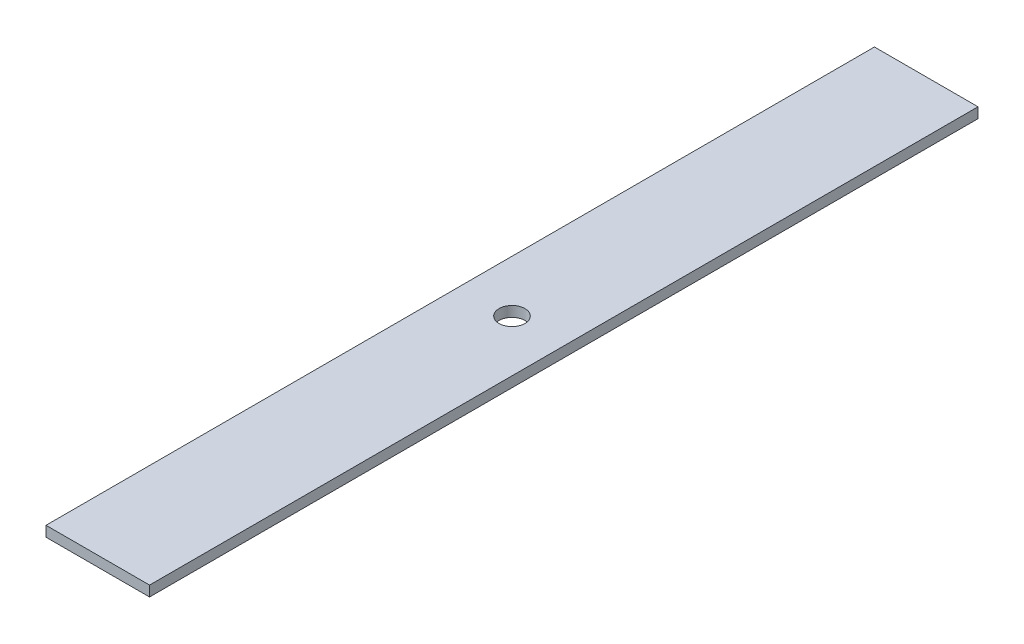
ISO-10303-21;
HEADER;
FILE_DESCRIPTION(('STEP AP214'),'2;1');
FILE_NAME('part.step','',(''),(''),'','','');
FILE_SCHEMA(('AUTOMOTIVE_DESIGN { 1 0 10303 214 1 1 1 1 }'));
ENDSEC;
DATA;
#1=APPLICATION_CONTEXT('core data for automotive mechanical design processes');
#2=APPLICATION_PROTOCOL_DEFINITION('international standard','automotive_design',2000,#1);
#3=PRODUCT_CONTEXT('',#1,'mechanical');
#4=PRODUCT('Part','Part','',(#3));
#5=PRODUCT_RELATED_PRODUCT_CATEGORY('part','',(#4));
#6=PRODUCT_DEFINITION_FORMATION('','',#4);
#7=PRODUCT_DEFINITION_CONTEXT('part definition',#1,'design');
#8=PRODUCT_DEFINITION('design','',#6,#7);
#9=PRODUCT_DEFINITION_SHAPE('','',#8);
#10=(LENGTH_UNIT() NAMED_UNIT(*) SI_UNIT(.MILLI.,.METRE.));
#11=(NAMED_UNIT(*) PLANE_ANGLE_UNIT() SI_UNIT($,.RADIAN.));
#12=(NAMED_UNIT(*) SI_UNIT($,.STERADIAN.) SOLID_ANGLE_UNIT());
#13=UNCERTAINTY_MEASURE_WITH_UNIT(LENGTH_MEASURE(1.E-05),#10,'distance_accuracy_value','');
#14=(GEOMETRIC_REPRESENTATION_CONTEXT(3) GLOBAL_UNCERTAINTY_ASSIGNED_CONTEXT((#13)) GLOBAL_UNIT_ASSIGNED_CONTEXT((#10,
#11,#12)) REPRESENTATION_CONTEXT('',''));
#15=CARTESIAN_POINT('',(0.,0.,0.));
#16=DIRECTION('',(0.,0.,1.));
#17=DIRECTION('',(1.,0.,0.));
#18=AXIS2_PLACEMENT_3D('',#15,#16,#17);
#19=CARTESIAN_POINT('',(0.,2.54,0.));
#20=DIRECTION('',(0.,-1.,0.));
#21=DIRECTION('',(0.,0.,-1.));
#22=AXIS2_PLACEMENT_3D('',#19,#20,#21);
#23=PLANE('',#22);
#24=DIRECTION('',(0.,0.,1.));
#25=VECTOR('',#24,1.);
#26=CARTESIAN_POINT('',(0.,2.54,0.));
#27=LINE('',#26,#25);
#28=CARTESIAN_POINT('',(0.,2.54,-203.2));
#29=VERTEX_POINT('',#28);
#30=CARTESIAN_POINT('',(0.,2.54,0.));
#31=VERTEX_POINT('',#30);
#32=EDGE_CURVE('E91',#29,#31,#27,.T.);
#33=ORIENTED_EDGE('',*,*,#32,.T.);
#34=DIRECTION('',(1.,0.,0.));
#35=VECTOR('',#34,1.);
#36=CARTESIAN_POINT('',(0.,2.54,0.));
#37=LINE('',#36,#35);
#38=CARTESIAN_POINT('',(25.4,2.54,0.));
#39=VERTEX_POINT('',#38);
#40=EDGE_CURVE('E86',#31,#39,#37,.T.);
#41=ORIENTED_EDGE('',*,*,#40,.T.);
#42=DIRECTION('',(0.,0.,-1.));
#43=VECTOR('',#42,1.);
#44=CARTESIAN_POINT('',(25.4,2.54,0.));
#45=LINE('',#44,#43);
#46=CARTESIAN_POINT('',(25.4,2.54,-203.2));
#47=VERTEX_POINT('',#46);
#48=EDGE_CURVE('E89',#39,#47,#45,.T.);
#49=ORIENTED_EDGE('',*,*,#48,.T.);
#50=DIRECTION('',(-1.,0.,0.));
#51=VECTOR('',#50,1.);
#52=CARTESIAN_POINT('',(0.,2.54,-203.2));
#53=LINE('',#52,#51);
#54=EDGE_CURVE('E56',#47,#29,#53,.T.);
#55=ORIENTED_EDGE('',*,*,#54,.T.);
#56=EDGE_LOOP('',(#33,#41,#49,#55));
#57=FACE_BOUND('',#56,.T.);
#58=CARTESIAN_POINT('',(12.7,2.54,-101.6));
#59=DIRECTION('',(0.,1.,0.));
#60=DIRECTION('',(0.,0.,1.));
#61=AXIS2_PLACEMENT_3D('',#58,#59,#60);
#62=CIRCLE('',#61,3.175);
#63=CARTESIAN_POINT('',(12.7,2.54,-98.425));
#64=VERTEX_POINT('',#63);
#65=EDGE_CURVE('E106',#64,#64,#62,.T.);
#66=ORIENTED_EDGE('',*,*,#65,.F.);
#67=EDGE_LOOP('',(#66));
#68=FACE_BOUND('',#67,.T.);
#69=ADVANCED_FACE('F39',(#57,#68),#23,.F.);
#70=CARTESIAN_POINT('',(0.,0.,0.));
#71=DIRECTION('',(0.,-1.,0.));
#72=DIRECTION('',(0.,0.,-1.));
#73=AXIS2_PLACEMENT_3D('',#70,#71,#72);
#74=PLANE('',#73);
#75=DIRECTION('',(0.,0.,1.));
#76=VECTOR('',#75,1.);
#77=CARTESIAN_POINT('',(0.,0.,0.));
#78=LINE('',#77,#76);
#79=CARTESIAN_POINT('',(0.,0.,-203.2));
#80=VERTEX_POINT('',#79);
#81=CARTESIAN_POINT('',(0.,0.,0.));
#82=VERTEX_POINT('',#81);
#83=EDGE_CURVE('E103',#80,#82,#78,.T.);
#84=ORIENTED_EDGE('',*,*,#83,.F.);
#85=DIRECTION('',(-1.,0.,0.));
#86=VECTOR('',#85,1.);
#87=CARTESIAN_POINT('',(0.,0.,-203.2));
#88=LINE('',#87,#86);
#89=CARTESIAN_POINT('',(25.4,0.,-203.2));
#90=VERTEX_POINT('',#89);
#91=EDGE_CURVE('E79',#90,#80,#88,.T.);
#92=ORIENTED_EDGE('',*,*,#91,.F.);
#93=DIRECTION('',(0.,0.,-1.));
#94=VECTOR('',#93,1.);
#95=CARTESIAN_POINT('',(25.4,0.,0.));
#96=LINE('',#95,#94);
#97=CARTESIAN_POINT('',(25.4,0.,0.));
#98=VERTEX_POINT('',#97);
#99=EDGE_CURVE('E73',#98,#90,#96,.T.);
#100=ORIENTED_EDGE('',*,*,#99,.F.);
#101=DIRECTION('',(1.,0.,0.));
#102=VECTOR('',#101,1.);
#103=CARTESIAN_POINT('',(0.,0.,0.));
#104=LINE('',#103,#102);
#105=EDGE_CURVE('E95',#82,#98,#104,.T.);
#106=ORIENTED_EDGE('',*,*,#105,.F.);
#107=EDGE_LOOP('',(#84,#92,#100,#106));
#108=FACE_BOUND('',#107,.T.);
#109=CARTESIAN_POINT('',(12.7,0.,-101.6));
#110=DIRECTION('',(0.,1.,0.));
#111=DIRECTION('',(0.,0.,1.));
#112=AXIS2_PLACEMENT_3D('',#109,#110,#111);
#113=CIRCLE('',#112,3.175);
#114=CARTESIAN_POINT('',(12.7,0.,-98.425));
#115=VERTEX_POINT('',#114);
#116=EDGE_CURVE('E118',#115,#115,#113,.T.);
#117=ORIENTED_EDGE('',*,*,#116,.T.);
#118=EDGE_LOOP('',(#117));
#119=FACE_BOUND('',#118,.T.);
#120=ADVANCED_FACE('F114',(#108,#119),#74,.T.);
#121=CARTESIAN_POINT('',(0.,2.54,0.));
#122=DIRECTION('',(1.,0.,0.));
#123=DIRECTION('',(0.,0.,-1.));
#124=AXIS2_PLACEMENT_3D('',#121,#122,#123);
#125=PLANE('',#124);
#126=ORIENTED_EDGE('',*,*,#83,.T.);
#127=DIRECTION('',(0.,-1.,0.));
#128=VECTOR('',#127,1.);
#129=CARTESIAN_POINT('',(0.,2.54,0.));
#130=LINE('',#129,#128);
#131=EDGE_CURVE('E11',#31,#82,#130,.T.);
#132=ORIENTED_EDGE('',*,*,#131,.F.);
#133=ORIENTED_EDGE('',*,*,#32,.F.);
#134=DIRECTION('',(0.,-1.,0.));
#135=VECTOR('',#134,1.);
#136=CARTESIAN_POINT('',(0.,2.54,-203.2));
#137=LINE('',#136,#135);
#138=EDGE_CURVE('E99',#29,#80,#137,.T.);
#139=ORIENTED_EDGE('',*,*,#138,.T.);
#140=EDGE_LOOP('',(#126,#132,#133,#139));
#141=FACE_BOUND('',#140,.T.);
#142=ADVANCED_FACE('F41',(#141),#125,.F.);
#143=CARTESIAN_POINT('',(0.,2.54,0.));
#144=DIRECTION('',(0.,0.,-1.));
#145=DIRECTION('',(-1.,0.,0.));
#146=AXIS2_PLACEMENT_3D('',#143,#144,#145);
#147=PLANE('',#146);
#148=ORIENTED_EDGE('',*,*,#105,.T.);
#149=DIRECTION('',(0.,-1.,0.));
#150=VECTOR('',#149,1.);
#151=CARTESIAN_POINT('',(25.4,2.54,0.));
#152=LINE('',#151,#150);
#153=EDGE_CURVE('E48',#39,#98,#152,.T.);
#154=ORIENTED_EDGE('',*,*,#153,.F.);
#155=ORIENTED_EDGE('',*,*,#40,.F.);
#156=ORIENTED_EDGE('',*,*,#131,.T.);
#157=EDGE_LOOP('',(#148,#154,#155,#156));
#158=FACE_BOUND('',#157,.T.);
#159=ADVANCED_FACE('F94',(#158),#147,.F.);
#160=CARTESIAN_POINT('',(25.4,2.54,0.));
#161=DIRECTION('',(-1.,0.,0.));
#162=DIRECTION('',(0.,0.,1.));
#163=AXIS2_PLACEMENT_3D('',#160,#161,#162);
#164=PLANE('',#163);
#165=ORIENTED_EDGE('',*,*,#99,.T.);
#166=DIRECTION('',(0.,-1.,0.));
#167=VECTOR('',#166,1.);
#168=CARTESIAN_POINT('',(25.4,2.54,-203.2));
#169=LINE('',#168,#167);
#170=EDGE_CURVE('E96',#47,#90,#169,.T.);
#171=ORIENTED_EDGE('',*,*,#170,.F.);
#172=ORIENTED_EDGE('',*,*,#48,.F.);
#173=ORIENTED_EDGE('',*,*,#153,.T.);
#174=EDGE_LOOP('',(#165,#171,#172,#173));
#175=FACE_BOUND('',#174,.T.);
#176=ADVANCED_FACE('F97',(#175),#164,.F.);
#177=CARTESIAN_POINT('',(0.,2.54,-203.2));
#178=DIRECTION('',(0.,0.,1.));
#179=DIRECTION('',(1.,0.,0.));
#180=AXIS2_PLACEMENT_3D('',#177,#178,#179);
#181=PLANE('',#180);
#182=ORIENTED_EDGE('',*,*,#91,.T.);
#183=ORIENTED_EDGE('',*,*,#138,.F.);
#184=ORIENTED_EDGE('',*,*,#54,.F.);
#185=ORIENTED_EDGE('',*,*,#170,.T.);
#186=EDGE_LOOP('',(#182,#183,#184,#185));
#187=FACE_BOUND('',#186,.T.);
#188=ADVANCED_FACE('F111',(#187),#181,.F.);
#189=CARTESIAN_POINT('',(12.7,2.54,-101.6));
#190=DIRECTION('',(0.,-1.,0.));
#191=DIRECTION('',(0.,0.,-1.));
#192=AXIS2_PLACEMENT_3D('',#189,#190,#191);
#193=CYLINDRICAL_SURFACE('',#192,3.175);
#194=ORIENTED_EDGE('',*,*,#65,.T.);
#195=EDGE_LOOP('',(#194));
#196=FACE_BOUND('',#195,.T.);
#197=ORIENTED_EDGE('',*,*,#116,.F.);
#198=EDGE_LOOP('',(#197));
#199=FACE_BOUND('',#198,.T.);
#200=ADVANCED_FACE('F124',(#196,#199),#193,.F.);
#201=CLOSED_SHELL('',(#69,#120,#142,#159,#176,#188,#200));
#202=MANIFOLD_SOLID_BREP('B2',#201);
#203=ADVANCED_BREP_SHAPE_REPRESENTATION('',(#18,#202),#14);
#204=SHAPE_DEFINITION_REPRESENTATION(#9,#203);
ENDSEC;
END-ISO-10303-21;
